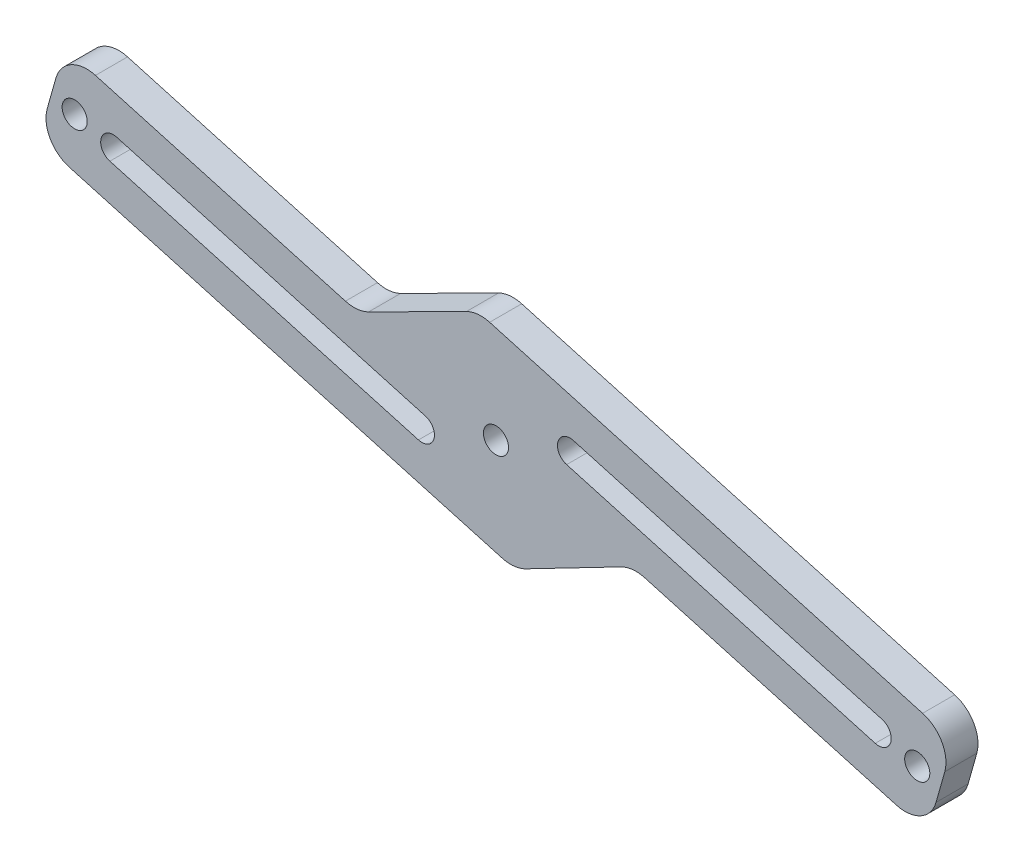
ISO-10303-21;
HEADER;
FILE_DESCRIPTION(('STEP AP214'),'2;1');
FILE_NAME('part.step','',(''),(''),'','','');
FILE_SCHEMA(('AUTOMOTIVE_DESIGN { 1 0 10303 214 1 1 1 1 }'));
ENDSEC;
DATA;
#1=APPLICATION_CONTEXT('core data for automotive mechanical design processes');
#2=APPLICATION_PROTOCOL_DEFINITION('international standard','automotive_design',2000,#1);
#3=PRODUCT_CONTEXT('',#1,'mechanical');
#4=PRODUCT('Part','Part','',(#3));
#5=PRODUCT_RELATED_PRODUCT_CATEGORY('part','',(#4));
#6=PRODUCT_DEFINITION_FORMATION('','',#4);
#7=PRODUCT_DEFINITION_CONTEXT('part definition',#1,'design');
#8=PRODUCT_DEFINITION('design','',#6,#7);
#9=PRODUCT_DEFINITION_SHAPE('','',#8);
#10=(LENGTH_UNIT() NAMED_UNIT(*) SI_UNIT(.MILLI.,.METRE.));
#11=(NAMED_UNIT(*) PLANE_ANGLE_UNIT() SI_UNIT($,.RADIAN.));
#12=(NAMED_UNIT(*) SI_UNIT($,.STERADIAN.) SOLID_ANGLE_UNIT());
#13=UNCERTAINTY_MEASURE_WITH_UNIT(LENGTH_MEASURE(1.E-05),#10,'distance_accuracy_value','');
#14=(GEOMETRIC_REPRESENTATION_CONTEXT(3) GLOBAL_UNCERTAINTY_ASSIGNED_CONTEXT((#13)) GLOBAL_UNIT_ASSIGNED_CONTEXT((#10,
#11,#12)) REPRESENTATION_CONTEXT('',''));
#15=CARTESIAN_POINT('',(0.,0.,0.));
#16=DIRECTION('',(0.,0.,1.));
#17=DIRECTION('',(1.,0.,0.));
#18=AXIS2_PLACEMENT_3D('',#15,#16,#17);
#19=CARTESIAN_POINT('',(500.472634342967,469.074485031773,6.35));
#20=DIRECTION('',(0.,0.,-1.));
#21=DIRECTION('',(-1.,0.,0.));
#22=AXIS2_PLACEMENT_3D('',#19,#20,#21);
#23=CYLINDRICAL_SURFACE('',#22,2.48920000000001);
#24=CARTESIAN_POINT('',(500.472634342967,469.074485031773,0.));
#25=DIRECTION('',(0.,0.,1.));
#26=DIRECTION('',(1.,0.,0.));
#27=AXIS2_PLACEMENT_3D('',#24,#25,#26);
#28=CIRCLE('',#27,2.48920000000001);
#29=CARTESIAN_POINT('',(501.148569899276,471.470153573896,0.));
#30=VERTEX_POINT('',#29);
#31=CARTESIAN_POINT('',(499.796698786657,466.67881648965,0.));
#32=VERTEX_POINT('',#31);
#33=EDGE_CURVE('E278',#30,#32,#28,.T.);
#34=ORIENTED_EDGE('',*,*,#33,.F.);
#35=DIRECTION('',(0.,0.,-1.));
#36=VECTOR('',#35,1.);
#37=CARTESIAN_POINT('',(501.148569899276,471.470153573896,6.35));
#38=LINE('',#37,#36);
#39=CARTESIAN_POINT('',(501.148569899276,471.470153573896,6.35));
#40=VERTEX_POINT('',#39);
#41=EDGE_CURVE('E296',#40,#30,#38,.T.);
#42=ORIENTED_EDGE('',*,*,#41,.F.);
#43=CARTESIAN_POINT('',(500.472634342967,469.074485031773,6.35));
#44=DIRECTION('',(0.,0.,1.));
#45=DIRECTION('',(1.,0.,0.));
#46=AXIS2_PLACEMENT_3D('',#43,#44,#45);
#47=CIRCLE('',#46,2.48920000000001);
#48=CARTESIAN_POINT('',(499.796698786657,466.67881648965,6.35));
#49=VERTEX_POINT('',#48);
#50=EDGE_CURVE('E233',#40,#49,#47,.T.);
#51=ORIENTED_EDGE('',*,*,#50,.T.);
#52=DIRECTION('',(0.,0.,-1.));
#53=VECTOR('',#52,1.);
#54=CARTESIAN_POINT('',(499.796698786657,466.67881648965,6.35));
#55=LINE('',#54,#53);
#56=EDGE_CURVE('E211',#49,#32,#55,.T.);
#57=ORIENTED_EDGE('',*,*,#56,.T.);
#58=EDGE_LOOP('',(#34,#42,#51,#57));
#59=FACE_BOUND('',#58,.T.);
#60=ADVANCED_FACE('F39',(#59),#23,.F.);
#61=CARTESIAN_POINT('',(160.169531661349,567.677058598008,6.35));
#62=DIRECTION('',(-0.271547306889591,-0.962425093251942,0.));
#63=DIRECTION('',(0.962425093251942,-0.271547306889591,0.));
#64=AXIS2_PLACEMENT_3D('',#61,#62,#63);
#65=PLANE('',#64);
#66=DIRECTION('',(-0.962425093251943,0.271547306889591,0.));
#67=VECTOR('',#66,1.);
#68=CARTESIAN_POINT('',(160.169531661349,567.677058598008,0.));
#69=LINE('',#68,#67);
#70=CARTESIAN_POINT('',(562.262563320775,454.226899586407,0.));
#71=VERTEX_POINT('',#70);
#72=EDGE_CURVE('E281',#71,#30,#69,.T.);
#73=ORIENTED_EDGE('',*,*,#72,.F.);
#74=DIRECTION('',(0.,0.,-1.));
#75=VECTOR('',#74,1.);
#76=CARTESIAN_POINT('',(562.262563320775,454.226899586407,6.35));
#77=LINE('',#76,#75);
#78=CARTESIAN_POINT('',(562.262563320775,454.226899586407,6.35));
#79=VERTEX_POINT('',#78);
#80=EDGE_CURVE('E294',#79,#71,#77,.T.);
#81=ORIENTED_EDGE('',*,*,#80,.F.);
#82=DIRECTION('',(-0.962425093251943,0.271547306889591,0.));
#83=VECTOR('',#82,1.);
#84=CARTESIAN_POINT('',(160.169531661349,567.677058598008,6.35));
#85=LINE('',#84,#83);
#86=EDGE_CURVE('E236',#79,#40,#85,.T.);
#87=ORIENTED_EDGE('',*,*,#86,.T.);
#88=ORIENTED_EDGE('',*,*,#41,.T.);
#89=EDGE_LOOP('',(#73,#81,#87,#88));
#90=FACE_BOUND('',#89,.T.);
#91=ADVANCED_FACE('F466',(#90),#65,.T.);
#92=CARTESIAN_POINT('',(561.586627764465,451.831231044284,6.35));
#93=DIRECTION('',(0.,0.,-1.));
#94=DIRECTION('',(-1.,0.,0.));
#95=AXIS2_PLACEMENT_3D('',#92,#93,#94);
#96=CYLINDRICAL_SURFACE('',#95,2.48920000000004);
#97=CARTESIAN_POINT('',(561.586627764465,451.831231044284,0.));
#98=DIRECTION('',(0.,0.,1.));
#99=DIRECTION('',(1.,0.,0.));
#100=AXIS2_PLACEMENT_3D('',#97,#98,#99);
#101=CIRCLE('',#100,2.48920000000004);
#102=CARTESIAN_POINT('',(560.910692208156,449.435562502161,0.));
#103=VERTEX_POINT('',#102);
#104=EDGE_CURVE('E284',#103,#71,#101,.T.);
#105=ORIENTED_EDGE('',*,*,#104,.F.);
#106=DIRECTION('',(0.,0.,-1.));
#107=VECTOR('',#106,1.);
#108=CARTESIAN_POINT('',(560.910692208156,449.435562502161,6.35));
#109=LINE('',#108,#107);
#110=CARTESIAN_POINT('',(560.910692208156,449.435562502161,6.35));
#111=VERTEX_POINT('',#110);
#112=EDGE_CURVE('E292',#111,#103,#109,.T.);
#113=ORIENTED_EDGE('',*,*,#112,.F.);
#114=CARTESIAN_POINT('',(561.586627764465,451.831231044284,6.35));
#115=DIRECTION('',(0.,0.,1.));
#116=DIRECTION('',(1.,0.,0.));
#117=AXIS2_PLACEMENT_3D('',#114,#115,#116);
#118=CIRCLE('',#117,2.48920000000004);
#119=EDGE_CURVE('E239',#111,#79,#118,.T.);
#120=ORIENTED_EDGE('',*,*,#119,.T.);
#121=ORIENTED_EDGE('',*,*,#80,.T.);
#122=EDGE_LOOP('',(#105,#113,#120,#121));
#123=FACE_BOUND('',#122,.T.);
#124=ADVANCED_FACE('F472',(#123),#96,.F.);
#125=CARTESIAN_POINT('',(471.136850143516,458.639858092432,6.35));
#126=DIRECTION('',(0.,0.,-1.));
#127=DIRECTION('',(-1.,0.,0.));
#128=AXIS2_PLACEMENT_3D('',#125,#126,#127);
#129=CYLINDRICAL_SURFACE('',#128,2.48919999999996);
#130=CARTESIAN_POINT('',(471.136850143516,458.639858092432,0.));
#131=DIRECTION('',(0.,0.,1.));
#132=DIRECTION('',(1.,0.,0.));
#133=AXIS2_PLACEMENT_3D('',#130,#131,#132);
#134=CIRCLE('',#133,2.48919999999996);
#135=CARTESIAN_POINT('',(470.460914587206,456.244189550309,0.));
#136=VERTEX_POINT('',#135);
#137=CARTESIAN_POINT('',(471.812785699825,461.035526634555,0.));
#138=VERTEX_POINT('',#137);
#139=EDGE_CURVE('E206',#136,#138,#134,.T.);
#140=ORIENTED_EDGE('',*,*,#139,.F.);
#141=DIRECTION('',(0.,0.,-1.));
#142=VECTOR('',#141,1.);
#143=CARTESIAN_POINT('',(470.460914587206,456.244189550309,6.35));
#144=LINE('',#143,#142);
#145=CARTESIAN_POINT('',(470.460914587206,456.244189550309,6.35));
#146=VERTEX_POINT('',#145);
#147=EDGE_CURVE('E201',#146,#136,#144,.T.);
#148=ORIENTED_EDGE('',*,*,#147,.F.);
#149=CARTESIAN_POINT('',(471.136850143516,458.639858092432,6.35));
#150=DIRECTION('',(0.,0.,1.));
#151=DIRECTION('',(1.,0.,0.));
#152=AXIS2_PLACEMENT_3D('',#149,#150,#151);
#153=CIRCLE('',#152,2.48919999999996);
#154=CARTESIAN_POINT('',(471.812785699825,461.035526634555,6.35));
#155=VERTEX_POINT('',#154);
#156=EDGE_CURVE('E204',#146,#155,#153,.T.);
#157=ORIENTED_EDGE('',*,*,#156,.T.);
#158=DIRECTION('',(0.,0.,-1.));
#159=VECTOR('',#158,1.);
#160=CARTESIAN_POINT('',(471.812785699825,461.035526634555,6.35));
#161=LINE('',#160,#159);
#162=EDGE_CURVE('E244',#155,#138,#161,.T.);
#163=ORIENTED_EDGE('',*,*,#162,.T.);
#164=EDGE_LOOP('',(#140,#148,#157,#163));
#165=FACE_BOUND('',#164,.T.);
#166=ADVANCED_FACE('F203',(#165),#129,.F.);
#167=CARTESIAN_POINT('',(153.92747371788,545.553792979426,6.35));
#168=DIRECTION('',(0.271547306889594,0.962425093251941,0.));
#169=DIRECTION('',(-0.962425093251942,0.271547306889594,0.));
#170=AXIS2_PLACEMENT_3D('',#167,#168,#169);
#171=PLANE('',#170);
#172=DIRECTION('',(0.962425093251942,-0.271547306889594,0.));
#173=VECTOR('',#172,1.);
#174=CARTESIAN_POINT('',(153.92747371788,545.553792979426,0.));
#175=LINE('',#174,#173);
#176=CARTESIAN_POINT('',(409.346921165708,473.487443537798,0.));
#177=VERTEX_POINT('',#176);
#178=EDGE_CURVE('E270',#177,#136,#175,.T.);
#179=ORIENTED_EDGE('',*,*,#178,.F.);
#180=DIRECTION('',(0.,0.,-1.));
#181=VECTOR('',#180,1.);
#182=CARTESIAN_POINT('',(409.346921165708,473.487443537798,6.35));
#183=LINE('',#182,#181);
#184=CARTESIAN_POINT('',(409.346921165708,473.487443537798,6.35));
#185=VERTEX_POINT('',#184);
#186=EDGE_CURVE('E212',#185,#177,#183,.T.);
#187=ORIENTED_EDGE('',*,*,#186,.F.);
#188=DIRECTION('',(0.962425093251942,-0.271547306889594,0.));
#189=VECTOR('',#188,1.);
#190=CARTESIAN_POINT('',(153.92747371788,545.553792979426,6.35));
#191=LINE('',#190,#189);
#192=EDGE_CURVE('E219',#185,#146,#191,.T.);
#193=ORIENTED_EDGE('',*,*,#192,.T.);
#194=ORIENTED_EDGE('',*,*,#147,.T.);
#195=EDGE_LOOP('',(#179,#187,#193,#194));
#196=FACE_BOUND('',#195,.T.);
#197=ADVANCED_FACE('F226',(#196),#171,.T.);
#198=CARTESIAN_POINT('',(410.022856722017,475.883112079921,6.35));
#199=DIRECTION('',(0.,0.,-1.));
#200=DIRECTION('',(-1.,0.,0.));
#201=AXIS2_PLACEMENT_3D('',#198,#199,#200);
#202=CYLINDRICAL_SURFACE('',#201,2.4891999999999);
#203=CARTESIAN_POINT('',(410.022856722017,475.883112079921,0.));
#204=DIRECTION('',(0.,0.,1.));
#205=DIRECTION('',(1.,0.,0.));
#206=AXIS2_PLACEMENT_3D('',#203,#204,#205);
#207=CIRCLE('',#206,2.4891999999999);
#208=CARTESIAN_POINT('',(410.698792278327,478.278780622044,0.));
#209=VERTEX_POINT('',#208);
#210=EDGE_CURVE('E272',#209,#177,#207,.T.);
#211=ORIENTED_EDGE('',*,*,#210,.F.);
#212=DIRECTION('',(0.,0.,-1.));
#213=VECTOR('',#212,1.);
#214=CARTESIAN_POINT('',(410.698792278327,478.278780622044,6.35));
#215=LINE('',#214,#213);
#216=CARTESIAN_POINT('',(410.698792278327,478.278780622044,6.35));
#217=VERTEX_POINT('',#216);
#218=EDGE_CURVE('E300',#217,#209,#215,.T.);
#219=ORIENTED_EDGE('',*,*,#218,.F.);
#220=CARTESIAN_POINT('',(410.022856722017,475.883112079921,6.35));
#221=DIRECTION('',(0.,0.,1.));
#222=DIRECTION('',(1.,0.,0.));
#223=AXIS2_PLACEMENT_3D('',#220,#221,#222);
#224=CIRCLE('',#223,2.4891999999999);
#225=EDGE_CURVE('E227',#217,#185,#224,.T.);
#226=ORIENTED_EDGE('',*,*,#225,.T.);
#227=ORIENTED_EDGE('',*,*,#186,.T.);
#228=EDGE_LOOP('',(#211,#219,#226,#227));
#229=FACE_BOUND('',#228,.T.);
#230=ADVANCED_FACE('F484',(#229),#202,.F.);
#231=CARTESIAN_POINT('',(162.080084203158,574.448489069109,6.35));
#232=DIRECTION('',(0.271547306889585,0.962425093251944,0.));
#233=DIRECTION('',(-0.962425093251944,0.271547306889585,0.));
#234=AXIS2_PLACEMENT_3D('',#231,#232,#233);
#235=PLANE('',#234);
#236=DIRECTION('',(0.962425093251944,-0.271547306889585,0.));
#237=VECTOR('',#236,1.);
#238=CARTESIAN_POINT('',(162.080084203158,574.448489069109,0.));
#239=LINE('',#238,#237);
#240=CARTESIAN_POINT('',(484.55130153564,483.463547768208,0.));
#241=VERTEX_POINT('',#240);
#242=CARTESIAN_POINT('',(570.284515204738,459.27400465876,0.));
#243=VERTEX_POINT('',#242);
#244=EDGE_CURVE('E245',#241,#243,#239,.T.);
#245=ORIENTED_EDGE('',*,*,#244,.F.);
#246=DIRECTION('',(0.,0.,-1.));
#247=VECTOR('',#246,1.);
#248=CARTESIAN_POINT('',(484.55130153564,483.463547768208,6.35));
#249=LINE('',#248,#247);
#250=CARTESIAN_POINT('',(484.55130153564,483.463547768208,6.35));
#251=VERTEX_POINT('',#250);
#252=EDGE_CURVE('E348',#241,#251,#249,.F.);
#253=ORIENTED_EDGE('',*,*,#252,.T.);
#254=DIRECTION('',(0.962425093251944,-0.271547306889585,0.));
#255=VECTOR('',#254,1.);
#256=CARTESIAN_POINT('',(162.080084203158,574.448489069109,6.35));
#257=LINE('',#256,#255);
#258=CARTESIAN_POINT('',(570.284515204738,459.27400465876,6.35));
#259=VERTEX_POINT('',#258);
#260=EDGE_CURVE('E290',#251,#259,#257,.T.);
#261=ORIENTED_EDGE('',*,*,#260,.T.);
#262=DIRECTION('',(0.,0.,-1.));
#263=VECTOR('',#262,1.);
#264=CARTESIAN_POINT('',(570.284515204738,459.27400465876,0.));
#265=LINE('',#264,#263);
#266=EDGE_CURVE('E345',#259,#243,#265,.T.);
#267=ORIENTED_EDGE('',*,*,#266,.T.);
#268=EDGE_LOOP('',(#245,#253,#261,#267));
#269=FACE_BOUND('',#268,.T.);
#270=ADVANCED_FACE('F416',(#269),#235,.T.);
#271=CARTESIAN_POINT('',(-96.9093270912384,192.289097804898,6.35));
#272=DIRECTION('',(0.450052679280969,-0.893002007764832,0.));
#273=DIRECTION('',(0.893002007764832,0.450052679280969,0.));
#274=AXIS2_PLACEMENT_3D('',#271,#272,#273);
#275=PLANE('',#274);
#276=DIRECTION('',(-0.893002007764832,-0.450052679280969,0.));
#277=VECTOR('',#276,1.);
#278=CARTESIAN_POINT('',(-96.9093270912384,192.289097804898,6.35));
#279=LINE('',#278,#277);
#280=CARTESIAN_POINT('',(479.969141623457,483.022711175365,6.35));
#281=VERTEX_POINT('',#280);
#282=CARTESIAN_POINT('',(460.57745657931,473.249743439564,6.35));
#283=VERTEX_POINT('',#282);
#284=EDGE_CURVE('E388',#281,#283,#279,.T.);
#285=ORIENTED_EDGE('',*,*,#284,.F.);
#286=DIRECTION('',(0.,0.,-1.));
#287=VECTOR('',#286,1.);
#288=CARTESIAN_POINT('',(479.969141623457,483.022711175365,0.));
#289=LINE('',#288,#287);
#290=CARTESIAN_POINT('',(479.969141623457,483.022711175365,0.));
#291=VERTEX_POINT('',#290);
#292=EDGE_CURVE('E342',#281,#291,#289,.T.);
#293=ORIENTED_EDGE('',*,*,#292,.T.);
#294=DIRECTION('',(-0.893002007764832,-0.450052679280969,0.));
#295=VECTOR('',#294,1.);
#296=CARTESIAN_POINT('',(-96.9093270912384,192.289097804898,0.));
#297=LINE('',#296,#295);
#298=CARTESIAN_POINT('',(460.57745657931,473.249743439564,0.));
#299=VERTEX_POINT('',#298);
#300=EDGE_CURVE('E248',#291,#299,#297,.T.);
#301=ORIENTED_EDGE('',*,*,#300,.T.);
#302=DIRECTION('',(0.,0.,-1.));
#303=VECTOR('',#302,1.);
#304=CARTESIAN_POINT('',(460.57745657931,473.249743439564,6.35));
#305=LINE('',#304,#303);
#306=EDGE_CURVE('E340',#299,#283,#305,.F.);
#307=ORIENTED_EDGE('',*,*,#306,.T.);
#308=EDGE_LOOP('',(#285,#293,#301,#307));
#309=FACE_BOUND('',#308,.T.);
#310=ADVANCED_FACE('F378',(#309),#275,.F.);
#311=CARTESIAN_POINT('',(157.189897372313,557.116560534774,6.35));
#312=DIRECTION('',(0.271547306889594,0.962425093251942,0.));
#313=DIRECTION('',(-0.962425093251942,0.271547306889594,0.));
#314=AXIS2_PLACEMENT_3D('',#311,#312,#313);
#315=PLANE('',#314);
#316=DIRECTION('',(0.962425093251942,-0.271547306889594,0.));
#317=VECTOR('',#316,1.);
#318=CARTESIAN_POINT('',(157.189897372313,557.116560534774,6.35));
#319=LINE('',#318,#317);
#320=CARTESIAN_POINT('',(406.497945477991,486.774536491895,6.35));
#321=VERTEX_POINT('',#320);
#322=CARTESIAN_POINT('',(455.995296667127,472.808906846721,6.35));
#323=VERTEX_POINT('',#322);
#324=EDGE_CURVE('E386',#321,#323,#319,.T.);
#325=ORIENTED_EDGE('',*,*,#324,.T.);
#326=DIRECTION('',(0.,0.,-1.));
#327=VECTOR('',#326,1.);
#328=CARTESIAN_POINT('',(455.995296667127,472.808906846721,6.35));
#329=LINE('',#328,#327);
#330=CARTESIAN_POINT('',(455.995296667127,472.808906846721,0.));
#331=VERTEX_POINT('',#330);
#332=EDGE_CURVE('E352',#323,#331,#329,.T.);
#333=ORIENTED_EDGE('',*,*,#332,.T.);
#334=DIRECTION('',(0.962425093251942,-0.271547306889594,0.));
#335=VECTOR('',#334,1.);
#336=CARTESIAN_POINT('',(157.189897372313,557.116560534774,0.));
#337=LINE('',#336,#335);
#338=CARTESIAN_POINT('',(406.497945477991,486.774536491895,0.));
#339=VERTEX_POINT('',#338);
#340=EDGE_CURVE('E252',#339,#331,#337,.T.);
#341=ORIENTED_EDGE('',*,*,#340,.F.);
#342=DIRECTION('',(0.,0.,-1.));
#343=VECTOR('',#342,1.);
#344=CARTESIAN_POINT('',(406.497945477991,486.774536491895,6.35));
#345=LINE('',#344,#343);
#346=EDGE_CURVE('E350',#339,#321,#345,.F.);
#347=ORIENTED_EDGE('',*,*,#346,.T.);
#348=EDGE_LOOP('',(#325,#333,#341,#347));
#349=FACE_BOUND('',#348,.T.);
#350=ADVANCED_FACE('F390',(#349),#315,.T.);
#351=CARTESIAN_POINT('',(243.196648763529,-68.6176986441301,6.35));
#352=DIRECTION('',(-0.962425093251942,0.271547306889593,0.));
#353=DIRECTION('',(-0.271547306889593,-0.962425093251942,0.));
#354=AXIS2_PLACEMENT_3D('',#351,#352,#353);
#355=PLANE('',#354);
#356=DIRECTION('',(0.271547306889593,0.962425093251942,0.));
#357=VECTOR('',#356,1.);
#358=CARTESIAN_POINT('',(243.196648763529,-68.6176986441301,6.35));
#359=LINE('',#358,#357);
#360=CARTESIAN_POINT('',(396.937895338343,476.276063206344,6.35));
#361=VERTEX_POINT('',#360);
#362=CARTESIAN_POINT('',(398.662220737092,482.387462548494,6.35));
#363=VERTEX_POINT('',#362);
#364=EDGE_CURVE('E392',#361,#363,#359,.T.);
#365=ORIENTED_EDGE('',*,*,#364,.T.);
#366=DIRECTION('',(0.,0.,-1.));
#367=VECTOR('',#366,1.);
#368=CARTESIAN_POINT('',(398.662220737092,482.387462548494,6.35));
#369=LINE('',#368,#367);
#370=CARTESIAN_POINT('',(398.662220737092,482.387462548494,0.));
#371=VERTEX_POINT('',#370);
#372=EDGE_CURVE('E357',#363,#371,#369,.T.);
#373=ORIENTED_EDGE('',*,*,#372,.T.);
#374=DIRECTION('',(0.271547306889593,0.962425093251942,0.));
#375=VECTOR('',#374,1.);
#376=CARTESIAN_POINT('',(243.196648763529,-68.6176986441301,0.));
#377=LINE('',#376,#375);
#378=CARTESIAN_POINT('',(396.937895338343,476.276063206344,0.));
#379=VERTEX_POINT('',#378);
#380=EDGE_CURVE('E255',#379,#371,#377,.T.);
#381=ORIENTED_EDGE('',*,*,#380,.F.);
#382=DIRECTION('',(0.,0.,-1.));
#383=VECTOR('',#382,1.);
#384=CARTESIAN_POINT('',(396.937895338343,476.276063206344,6.35));
#385=LINE('',#384,#383);
#386=EDGE_CURVE('E355',#379,#361,#385,.F.);
#387=ORIENTED_EDGE('',*,*,#386,.T.);
#388=EDGE_LOOP('',(#365,#373,#381,#387));
#389=FACE_BOUND('',#388,.T.);
#390=ADVANCED_FACE('F504',(#389),#355,.T.);
#391=CARTESIAN_POINT('',(152.016921176066,538.782362508324,6.35));
#392=DIRECTION('',(-0.271547306889593,-0.962425093251942,0.));
#393=DIRECTION('',(0.962425093251942,-0.271547306889593,0.));
#394=AXIS2_PLACEMENT_3D('',#391,#392,#393);
#395=PLANE('',#394);
#396=DIRECTION('',(-0.962425093251942,0.271547306889593,0.));
#397=VECTOR('',#396,1.);
#398=CARTESIAN_POINT('',(152.016921176066,538.782362508324,0.));
#399=LINE('',#398,#397);
#400=CARTESIAN_POINT('',(487.019826565786,444.261617572849,0.));
#401=VERTEX_POINT('',#400);
#402=CARTESIAN_POINT('',(401.324969281744,468.440338465445,0.));
#403=VERTEX_POINT('',#402);
#404=EDGE_CURVE('E258',#401,#403,#399,.T.);
#405=ORIENTED_EDGE('',*,*,#404,.F.);
#406=DIRECTION('',(0.,0.,-1.));
#407=VECTOR('',#406,1.);
#408=CARTESIAN_POINT('',(487.019826565786,444.261617572849,6.35));
#409=LINE('',#408,#407);
#410=CARTESIAN_POINT('',(487.019826565786,444.261617572849,6.35));
#411=VERTEX_POINT('',#410);
#412=EDGE_CURVE('E327',#401,#411,#409,.F.);
#413=ORIENTED_EDGE('',*,*,#412,.T.);
#414=DIRECTION('',(-0.962425093251942,0.271547306889593,0.));
#415=VECTOR('',#414,1.);
#416=CARTESIAN_POINT('',(152.016921176066,538.782362508324,6.35));
#417=LINE('',#416,#415);
#418=CARTESIAN_POINT('',(401.324969281744,468.440338465445,6.35));
#419=VERTEX_POINT('',#418);
#420=EDGE_CURVE('E395',#411,#419,#417,.T.);
#421=ORIENTED_EDGE('',*,*,#420,.T.);
#422=DIRECTION('',(0.,0.,-1.));
#423=VECTOR('',#422,1.);
#424=CARTESIAN_POINT('',(401.324969281744,468.440338465445,6.35));
#425=LINE('',#424,#423);
#426=EDGE_CURVE('E324',#419,#403,#425,.T.);
#427=ORIENTED_EDGE('',*,*,#426,.T.);
#428=EDGE_LOOP('',(#405,#413,#421,#427));
#429=FACE_BOUND('',#428,.T.);
#430=ADVANCED_FACE('F500',(#429),#395,.T.);
#431=CARTESIAN_POINT('',(-77.6544513005473,149.99994252272,6.35));
#432=DIRECTION('',(-0.459741780517421,0.888052642159614,0.));
#433=DIRECTION('',(-0.888052642159614,-0.459741780517421,0.));
#434=AXIS2_PLACEMENT_3D('',#431,#432,#433);
#435=PLANE('',#434);
#436=DIRECTION('',(0.888052642159614,0.459741780517421,0.));
#437=VECTOR('',#436,1.);
#438=CARTESIAN_POINT('',(-77.6544513005473,149.99994252272,0.));
#439=LINE('',#438,#437);
#440=CARTESIAN_POINT('',(491.663512270821,444.733882637285,0.));
#441=VERTEX_POINT('',#440);
#442=CARTESIAN_POINT('',(510.600589118493,454.537541806151,0.));
#443=VERTEX_POINT('',#442);
#444=EDGE_CURVE('E261',#441,#443,#439,.T.);
#445=ORIENTED_EDGE('',*,*,#444,.T.);
#446=DIRECTION('',(0.,0.,-1.));
#447=VECTOR('',#446,1.);
#448=CARTESIAN_POINT('',(510.600589118493,454.537541806151,6.35));
#449=LINE('',#448,#447);
#450=CARTESIAN_POINT('',(510.600589118493,454.537541806151,6.35));
#451=VERTEX_POINT('',#450);
#452=EDGE_CURVE('E310',#443,#451,#449,.F.);
#453=ORIENTED_EDGE('',*,*,#452,.T.);
#454=DIRECTION('',(0.888052642159614,0.459741780517421,0.));
#455=VECTOR('',#454,1.);
#456=CARTESIAN_POINT('',(-77.6544513005473,149.99994252272,6.35));
#457=LINE('',#456,#455);
#458=CARTESIAN_POINT('',(491.663512270821,444.733882637285,6.35));
#459=VERTEX_POINT('',#458);
#460=EDGE_CURVE('E402',#459,#451,#457,.T.);
#461=ORIENTED_EDGE('',*,*,#460,.F.);
#462=DIRECTION('',(0.,0.,-1.));
#463=VECTOR('',#462,1.);
#464=CARTESIAN_POINT('',(491.663512270821,444.733882637285,0.));
#465=LINE('',#464,#463);
#466=EDGE_CURVE('E307',#459,#441,#465,.T.);
#467=ORIENTED_EDGE('',*,*,#466,.T.);
#468=EDGE_LOOP('',(#445,#453,#461,#467));
#469=FACE_BOUND('',#468,.T.);
#470=ADVANCED_FACE('F496',(#469),#435,.F.);
#471=CARTESIAN_POINT('',(156.907108006918,556.114291042661,6.35));
#472=DIRECTION('',(-0.271547306889594,-0.962425093251942,0.));
#473=DIRECTION('',(0.962425093251942,-0.271547306889594,0.));
#474=AXIS2_PLACEMENT_3D('',#471,#472,#473);
#475=PLANE('',#474);
#476=DIRECTION('',(-0.962425093251942,0.271547306889594,0.));
#477=VECTOR('',#476,1.);
#478=CARTESIAN_POINT('',(156.907108006918,556.114291042661,6.35));
#479=LINE('',#478,#477);
#480=CARTESIAN_POINT('',(565.111539008492,440.93980663231,6.35));
#481=VERTEX_POINT('',#480);
#482=CARTESIAN_POINT('',(515.244274823527,455.009806870588,6.35));
#483=VERTEX_POINT('',#482);
#484=EDGE_CURVE('E405',#481,#483,#479,.T.);
#485=ORIENTED_EDGE('',*,*,#484,.T.);
#486=DIRECTION('',(0.,0.,-1.));
#487=VECTOR('',#486,1.);
#488=CARTESIAN_POINT('',(515.244274823527,455.009806870588,6.35));
#489=LINE('',#488,#487);
#490=CARTESIAN_POINT('',(515.244274823527,455.009806870588,0.));
#491=VERTEX_POINT('',#490);
#492=EDGE_CURVE('E304',#483,#491,#489,.T.);
#493=ORIENTED_EDGE('',*,*,#492,.T.);
#494=DIRECTION('',(-0.962425093251942,0.271547306889594,0.));
#495=VECTOR('',#494,1.);
#496=CARTESIAN_POINT('',(156.907108006918,556.114291042661,0.));
#497=LINE('',#496,#495);
#498=CARTESIAN_POINT('',(565.111539008492,440.93980663231,0.));
#499=VERTEX_POINT('',#498);
#500=EDGE_CURVE('E264',#499,#491,#497,.T.);
#501=ORIENTED_EDGE('',*,*,#500,.F.);
#502=DIRECTION('',(0.,0.,-1.));
#503=VECTOR('',#502,1.);
#504=CARTESIAN_POINT('',(565.111539008492,440.93980663231,6.35));
#505=LINE('',#504,#503);
#506=EDGE_CURVE('E298',#499,#481,#505,.F.);
#507=ORIENTED_EDGE('',*,*,#506,.T.);
#508=EDGE_LOOP('',(#485,#493,#501,#507));
#509=FACE_BOUND('',#508,.T.);
#510=ADVANCED_FACE('F482',(#509),#475,.T.);
#511=CARTESIAN_POINT('',(155.279344830498,550.345130063672,6.35));
#512=DIRECTION('',(0.271547306889592,0.962425093251942,0.));
#513=DIRECTION('',(-0.962425093251942,0.271547306889592,0.));
#514=AXIS2_PLACEMENT_3D('',#511,#512,#513);
#515=PLANE('',#514);
#516=DIRECTION('',(0.962425093251942,-0.271547306889592,0.));
#517=VECTOR('',#516,1.);
#518=CARTESIAN_POINT('',(155.279344830498,550.345130063672,0.));
#519=LINE('',#518,#517);
#520=EDGE_CURVE('E275',#209,#138,#519,.T.);
#521=ORIENTED_EDGE('',*,*,#520,.T.);
#522=ORIENTED_EDGE('',*,*,#162,.F.);
#523=DIRECTION('',(0.962425093251942,-0.271547306889592,0.));
#524=VECTOR('',#523,1.);
#525=CARTESIAN_POINT('',(155.279344830498,550.345130063672,6.35));
#526=LINE('',#525,#524);
#527=EDGE_CURVE('E222',#217,#155,#526,.T.);
#528=ORIENTED_EDGE('',*,*,#527,.F.);
#529=ORIENTED_EDGE('',*,*,#218,.T.);
#530=EDGE_LOOP('',(#521,#522,#528,#529));
#531=FACE_BOUND('',#530,.T.);
#532=ADVANCED_FACE('F478',(#531),#515,.F.);
#533=CARTESIAN_POINT('',(414.315830343723,-116.8988098091,6.35));
#534=DIRECTION('',(-0.962425093251941,0.271547306889595,0.));
#535=DIRECTION('',(-0.271547306889595,-0.962425093251942,0.));
#536=AXIS2_PLACEMENT_3D('',#533,#534,#535);
#537=PLANE('',#536);
#538=DIRECTION('',(0.271547306889595,0.962425093251942,0.));
#539=VECTOR('',#538,1.);
#540=CARTESIAN_POINT('',(414.315830343723,-116.8988098091,0.));
#541=LINE('',#540,#539);
#542=CARTESIAN_POINT('',(572.947263749391,445.326880575711,0.));
#543=VERTEX_POINT('',#542);
#544=CARTESIAN_POINT('',(574.67158914814,451.438279917861,0.));
#545=VERTEX_POINT('',#544);
#546=EDGE_CURVE('E267',#543,#545,#541,.T.);
#547=ORIENTED_EDGE('',*,*,#546,.T.);
#548=DIRECTION('',(0.,0.,-1.));
#549=VECTOR('',#548,1.);
#550=CARTESIAN_POINT('',(574.671589148139,451.438279917861,6.35));
#551=LINE('',#550,#549);
#552=CARTESIAN_POINT('',(574.67158914814,451.438279917861,6.35));
#553=VERTEX_POINT('',#552);
#554=EDGE_CURVE('E54',#545,#553,#551,.F.);
#555=ORIENTED_EDGE('',*,*,#554,.T.);
#556=DIRECTION('',(0.271547306889595,0.962425093251942,0.));
#557=VECTOR('',#556,1.);
#558=CARTESIAN_POINT('',(414.315830343723,-116.8988098091,6.35));
#559=LINE('',#558,#557);
#560=CARTESIAN_POINT('',(572.947263749391,445.326880575711,6.35));
#561=VERTEX_POINT('',#560);
#562=EDGE_CURVE('E224',#561,#553,#559,.T.);
#563=ORIENTED_EDGE('',*,*,#562,.F.);
#564=DIRECTION('',(0.,0.,-1.));
#565=VECTOR('',#564,1.);
#566=CARTESIAN_POINT('',(572.947263749391,445.326880575711,0.));
#567=LINE('',#566,#565);
#568=EDGE_CURVE('E360',#561,#543,#567,.T.);
#569=ORIENTED_EDGE('',*,*,#568,.T.);
#570=EDGE_LOOP('',(#547,#555,#563,#569));
#571=FACE_BOUND('',#570,.T.);
#572=ADVANCED_FACE('F481',(#571),#537,.F.);
#573=CARTESIAN_POINT('',(158.817660548731,562.885721513763,6.35));
#574=DIRECTION('',(-0.271547306889592,-0.962425093251942,0.));
#575=DIRECTION('',(0.962425093251942,-0.271547306889592,0.));
#576=AXIS2_PLACEMENT_3D('',#573,#574,#575);
#577=PLANE('',#576);
#578=DIRECTION('',(-0.962425093251942,0.271547306889592,0.));
#579=VECTOR('',#578,1.);
#580=CARTESIAN_POINT('',(158.817660548731,562.885721513763,0.));
#581=LINE('',#580,#579);
#582=EDGE_CURVE('E287',#103,#32,#581,.T.);
#583=ORIENTED_EDGE('',*,*,#582,.T.);
#584=ORIENTED_EDGE('',*,*,#56,.F.);
#585=DIRECTION('',(-0.962425093251942,0.271547306889592,0.));
#586=VECTOR('',#585,1.);
#587=CARTESIAN_POINT('',(158.817660548731,562.885721513763,6.35));
#588=LINE('',#587,#586);
#589=EDGE_CURVE('E242',#111,#49,#588,.T.);
#590=ORIENTED_EDGE('',*,*,#589,.F.);
#591=ORIENTED_EDGE('',*,*,#112,.T.);
#592=EDGE_LOOP('',(#583,#584,#590,#591));
#593=FACE_BOUND('',#592,.T.);
#594=ADVANCED_FACE('F445',(#593),#577,.F.);
#595=CARTESIAN_POINT('',(0.,0.,6.35));
#596=DIRECTION('',(0.,0.,1.));
#597=DIRECTION('',(1.,0.,0.));
#598=AXIS2_PLACEMENT_3D('',#595,#596,#597);
#599=PLANE('',#598);
#600=CARTESIAN_POINT('',(402.38360754433,478.038518828357,6.35));
#601=DIRECTION('',(0.,0.,1.));
#602=DIRECTION('',(1.,0.,0.));
#603=AXIS2_PLACEMENT_3D('',#600,#601,#602);
#604=CIRCLE('',#603,2.48920000000001);
#605=CARTESIAN_POINT('',(404.87280754433,478.038518828357,6.35));
#606=VERTEX_POINT('',#605);
#607=EDGE_CURVE('E432',#606,#606,#604,.T.);
#608=ORIENTED_EDGE('',*,*,#607,.F.);
#609=EDGE_LOOP('',(#608));
#610=FACE_BOUND('',#609,.T.);
#611=CARTESIAN_POINT('',(569.225876942153,449.675824295848,6.35));
#612=DIRECTION('',(0.,0.,1.));
#613=DIRECTION('',(1.,0.,0.));
#614=AXIS2_PLACEMENT_3D('',#611,#612,#613);
#615=CIRCLE('',#614,2.48919999999995);
#616=CARTESIAN_POINT('',(571.715076942153,449.675824295848,6.35));
#617=VERTEX_POINT('',#616);
#618=EDGE_CURVE('E426',#617,#617,#615,.T.);
#619=ORIENTED_EDGE('',*,*,#618,.F.);
#620=EDGE_LOOP('',(#619));
#621=FACE_BOUND('',#620,.T.);
#622=CARTESIAN_POINT('',(485.804742243241,463.857171562102,6.35));
#623=DIRECTION('',(0.,0.,1.));
#624=DIRECTION('',(1.,0.,0.));
#625=AXIS2_PLACEMENT_3D('',#622,#623,#624);
#626=CIRCLE('',#625,2.48920000000001);
#627=CARTESIAN_POINT('',(488.293942243242,463.857171562102,6.35));
#628=VERTEX_POINT('',#627);
#629=EDGE_CURVE('E423',#628,#628,#626,.T.);
#630=ORIENTED_EDGE('',*,*,#629,.F.);
#631=EDGE_LOOP('',(#630));
#632=FACE_BOUND('',#631,.T.);
#633=ORIENTED_EDGE('',*,*,#420,.F.);
#634=CARTESIAN_POINT('',(488.744151964535,450.373016914999,6.35));
#635=DIRECTION('',(0.,0.,1.));
#636=DIRECTION('',(1.,0.,0.));
#637=AXIS2_PLACEMENT_3D('',#634,#635,#636);
#638=CIRCLE('',#637,6.35);
#639=EDGE_CURVE('E338',#411,#459,#638,.T.);
#640=ORIENTED_EDGE('',*,*,#639,.T.);
#641=ORIENTED_EDGE('',*,*,#460,.T.);
#642=CARTESIAN_POINT('',(513.519949424778,448.898407528438,6.35));
#643=DIRECTION('',(0.,0.,1.));
#644=DIRECTION('',(1.,0.,0.));
#645=AXIS2_PLACEMENT_3D('',#642,#643,#644);
#646=CIRCLE('',#645,6.35);
#647=EDGE_CURVE('E366',#451,#483,#646,.F.);
#648=ORIENTED_EDGE('',*,*,#647,.T.);
#649=ORIENTED_EDGE('',*,*,#484,.F.);
#650=CARTESIAN_POINT('',(566.835864407241,447.05120597446,6.35));
#651=DIRECTION('',(0.,0.,1.));
#652=DIRECTION('',(1.,0.,0.));
#653=AXIS2_PLACEMENT_3D('',#650,#651,#652);
#654=CIRCLE('',#653,6.35);
#655=EDGE_CURVE('E61',#481,#561,#654,.T.);
#656=ORIENTED_EDGE('',*,*,#655,.T.);
#657=ORIENTED_EDGE('',*,*,#562,.T.);
#658=CARTESIAN_POINT('',(568.56018980599,453.16260531661,6.35));
#659=DIRECTION('',(0.,0.,1.));
#660=DIRECTION('',(1.,0.,0.));
#661=AXIS2_PLACEMENT_3D('',#658,#659,#660);
#662=CIRCLE('',#661,6.35);
#663=EDGE_CURVE('E332',#553,#259,#662,.T.);
#664=ORIENTED_EDGE('',*,*,#663,.T.);
#665=ORIENTED_EDGE('',*,*,#260,.F.);
#666=CARTESIAN_POINT('',(482.826976136891,477.352148426058,6.35));
#667=DIRECTION('',(0.,0.,1.));
#668=DIRECTION('',(1.,0.,0.));
#669=AXIS2_PLACEMENT_3D('',#666,#667,#668);
#670=CIRCLE('',#669,6.35);
#671=EDGE_CURVE('E336',#251,#281,#670,.T.);
#672=ORIENTED_EDGE('',*,*,#671,.T.);
#673=ORIENTED_EDGE('',*,*,#284,.T.);
#674=CARTESIAN_POINT('',(457.719622065876,478.920306188871,6.35));
#675=DIRECTION('',(0.,0.,1.));
#676=DIRECTION('',(1.,0.,0.));
#677=AXIS2_PLACEMENT_3D('',#674,#675,#676);
#678=CIRCLE('',#677,6.35);
#679=EDGE_CURVE('E11',#283,#323,#678,.F.);
#680=ORIENTED_EDGE('',*,*,#679,.T.);
#681=ORIENTED_EDGE('',*,*,#324,.F.);
#682=CARTESIAN_POINT('',(404.773620079242,480.663137149745,6.35));
#683=DIRECTION('',(0.,0.,1.));
#684=DIRECTION('',(1.,0.,0.));
#685=AXIS2_PLACEMENT_3D('',#682,#683,#684);
#686=CIRCLE('',#685,6.35);
#687=EDGE_CURVE('E334',#321,#363,#686,.T.);
#688=ORIENTED_EDGE('',*,*,#687,.T.);
#689=ORIENTED_EDGE('',*,*,#364,.F.);
#690=CARTESIAN_POINT('',(403.049294680493,474.551737807595,6.35));
#691=DIRECTION('',(0.,0.,1.));
#692=DIRECTION('',(1.,0.,0.));
#693=AXIS2_PLACEMENT_3D('',#690,#691,#692);
#694=CIRCLE('',#693,6.35);
#695=EDGE_CURVE('E329',#361,#419,#694,.T.);
#696=ORIENTED_EDGE('',*,*,#695,.T.);
#697=EDGE_LOOP('',(#633,#640,#641,#648,#649,#656,#657,#664,#665,#672,#673,#680,#681,#688,#689,#696));
#698=FACE_BOUND('',#697,.T.);
#699=ORIENTED_EDGE('',*,*,#156,.F.);
#700=ORIENTED_EDGE('',*,*,#192,.F.);
#701=ORIENTED_EDGE('',*,*,#225,.F.);
#702=ORIENTED_EDGE('',*,*,#527,.T.);
#703=EDGE_LOOP('',(#699,#700,#701,#702));
#704=FACE_BOUND('',#703,.T.);
#705=ORIENTED_EDGE('',*,*,#50,.F.);
#706=ORIENTED_EDGE('',*,*,#86,.F.);
#707=ORIENTED_EDGE('',*,*,#119,.F.);
#708=ORIENTED_EDGE('',*,*,#589,.T.);
#709=EDGE_LOOP('',(#705,#706,#707,#708));
#710=FACE_BOUND('',#709,.T.);
#711=ADVANCED_FACE('F216',(#610,#621,#632,#698,#704,#710),#599,.T.);
#712=CARTESIAN_POINT('',(0.,0.,0.));
#713=DIRECTION('',(0.,0.,1.));
#714=DIRECTION('',(1.,0.,0.));
#715=AXIS2_PLACEMENT_3D('',#712,#713,#714);
#716=PLANE('',#715);
#717=CARTESIAN_POINT('',(402.38360754433,478.038518828357,0.));
#718=DIRECTION('',(0.,0.,1.));
#719=DIRECTION('',(1.,0.,0.));
#720=AXIS2_PLACEMENT_3D('',#717,#718,#719);
#721=CIRCLE('',#720,2.48920000000001);
#722=CARTESIAN_POINT('',(404.87280754433,478.038518828357,0.));
#723=VERTEX_POINT('',#722);
#724=EDGE_CURVE('E429',#723,#723,#721,.T.);
#725=ORIENTED_EDGE('',*,*,#724,.T.);
#726=EDGE_LOOP('',(#725));
#727=FACE_BOUND('',#726,.T.);
#728=CARTESIAN_POINT('',(569.225876942153,449.675824295848,0.));
#729=DIRECTION('',(0.,0.,1.));
#730=DIRECTION('',(1.,0.,0.));
#731=AXIS2_PLACEMENT_3D('',#728,#729,#730);
#732=CIRCLE('',#731,2.48919999999995);
#733=CARTESIAN_POINT('',(571.715076942153,449.675824295848,0.));
#734=VERTEX_POINT('',#733);
#735=EDGE_CURVE('E435',#734,#734,#732,.T.);
#736=ORIENTED_EDGE('',*,*,#735,.T.);
#737=EDGE_LOOP('',(#736));
#738=FACE_BOUND('',#737,.T.);
#739=CARTESIAN_POINT('',(485.804742243241,463.857171562102,0.));
#740=DIRECTION('',(0.,0.,1.));
#741=DIRECTION('',(1.,0.,0.));
#742=AXIS2_PLACEMENT_3D('',#739,#740,#741);
#743=CIRCLE('',#742,2.48920000000001);
#744=CARTESIAN_POINT('',(488.293942243242,463.857171562102,0.));
#745=VERTEX_POINT('',#744);
#746=EDGE_CURVE('E249',#745,#745,#743,.T.);
#747=ORIENTED_EDGE('',*,*,#746,.T.);
#748=EDGE_LOOP('',(#747));
#749=FACE_BOUND('',#748,.T.);
#750=ORIENTED_EDGE('',*,*,#444,.F.);
#751=CARTESIAN_POINT('',(488.744151964535,450.373016914999,0.));
#752=DIRECTION('',(0.,0.,1.));
#753=DIRECTION('',(1.,0.,0.));
#754=AXIS2_PLACEMENT_3D('',#751,#752,#753);
#755=CIRCLE('',#754,6.35);
#756=EDGE_CURVE('E322',#441,#401,#755,.F.);
#757=ORIENTED_EDGE('',*,*,#756,.T.);
#758=ORIENTED_EDGE('',*,*,#404,.T.);
#759=CARTESIAN_POINT('',(403.049294680493,474.551737807595,0.));
#760=DIRECTION('',(0.,0.,1.));
#761=DIRECTION('',(1.,0.,0.));
#762=AXIS2_PLACEMENT_3D('',#759,#760,#761);
#763=CIRCLE('',#762,6.35);
#764=EDGE_CURVE('E312',#403,#379,#763,.F.);
#765=ORIENTED_EDGE('',*,*,#764,.T.);
#766=ORIENTED_EDGE('',*,*,#380,.T.);
#767=CARTESIAN_POINT('',(404.773620079242,480.663137149745,0.));
#768=DIRECTION('',(0.,0.,1.));
#769=DIRECTION('',(1.,0.,0.));
#770=AXIS2_PLACEMENT_3D('',#767,#768,#769);
#771=CIRCLE('',#770,6.35);
#772=EDGE_CURVE('E318',#371,#339,#771,.F.);
#773=ORIENTED_EDGE('',*,*,#772,.T.);
#774=ORIENTED_EDGE('',*,*,#340,.T.);
#775=CARTESIAN_POINT('',(457.719622065876,478.920306188871,0.));
#776=DIRECTION('',(0.,0.,1.));
#777=DIRECTION('',(1.,0.,0.));
#778=AXIS2_PLACEMENT_3D('',#775,#776,#777);
#779=CIRCLE('',#778,6.35);
#780=EDGE_CURVE('E47',#331,#299,#779,.T.);
#781=ORIENTED_EDGE('',*,*,#780,.T.);
#782=ORIENTED_EDGE('',*,*,#300,.F.);
#783=CARTESIAN_POINT('',(482.826976136891,477.352148426058,0.));
#784=DIRECTION('',(0.,0.,1.));
#785=DIRECTION('',(1.,0.,0.));
#786=AXIS2_PLACEMENT_3D('',#783,#784,#785);
#787=CIRCLE('',#786,6.35);
#788=EDGE_CURVE('E320',#291,#241,#787,.F.);
#789=ORIENTED_EDGE('',*,*,#788,.T.);
#790=ORIENTED_EDGE('',*,*,#244,.T.);
#791=CARTESIAN_POINT('',(568.56018980599,453.16260531661,0.));
#792=DIRECTION('',(0.,0.,1.));
#793=DIRECTION('',(1.,0.,0.));
#794=AXIS2_PLACEMENT_3D('',#791,#792,#793);
#795=CIRCLE('',#794,6.35);
#796=EDGE_CURVE('E316',#243,#545,#795,.F.);
#797=ORIENTED_EDGE('',*,*,#796,.T.);
#798=ORIENTED_EDGE('',*,*,#546,.F.);
#799=CARTESIAN_POINT('',(566.835864407241,447.05120597446,0.));
#800=DIRECTION('',(0.,0.,1.));
#801=DIRECTION('',(1.,0.,0.));
#802=AXIS2_PLACEMENT_3D('',#799,#800,#801);
#803=CIRCLE('',#802,6.35);
#804=EDGE_CURVE('E314',#543,#499,#803,.F.);
#805=ORIENTED_EDGE('',*,*,#804,.T.);
#806=ORIENTED_EDGE('',*,*,#500,.T.);
#807=CARTESIAN_POINT('',(513.519949424778,448.898407528438,0.));
#808=DIRECTION('',(0.,0.,1.));
#809=DIRECTION('',(1.,0.,0.));
#810=AXIS2_PLACEMENT_3D('',#807,#808,#809);
#811=CIRCLE('',#810,6.35);
#812=EDGE_CURVE('E364',#491,#443,#811,.T.);
#813=ORIENTED_EDGE('',*,*,#812,.T.);
#814=EDGE_LOOP('',(#750,#757,#758,#765,#766,#773,#774,#781,#782,#789,#790,#797,#798,#805,#806,#813));
#815=FACE_BOUND('',#814,.T.);
#816=ORIENTED_EDGE('',*,*,#139,.T.);
#817=ORIENTED_EDGE('',*,*,#520,.F.);
#818=ORIENTED_EDGE('',*,*,#210,.T.);
#819=ORIENTED_EDGE('',*,*,#178,.T.);
#820=EDGE_LOOP('',(#816,#817,#818,#819));
#821=FACE_BOUND('',#820,.T.);
#822=ORIENTED_EDGE('',*,*,#33,.T.);
#823=ORIENTED_EDGE('',*,*,#582,.F.);
#824=ORIENTED_EDGE('',*,*,#104,.T.);
#825=ORIENTED_EDGE('',*,*,#72,.T.);
#826=EDGE_LOOP('',(#822,#823,#824,#825));
#827=FACE_BOUND('',#826,.T.);
#828=ADVANCED_FACE('F370',(#727,#738,#749,#815,#821,#827),#716,.F.);
#829=CARTESIAN_POINT('',(513.519949424778,448.898407528438,6.35));
#830=DIRECTION('',(0.,0.,-1.));
#831=DIRECTION('',(-1.,0.,0.));
#832=AXIS2_PLACEMENT_3D('',#829,#830,#831);
#833=CYLINDRICAL_SURFACE('',#832,6.35);
#834=ORIENTED_EDGE('',*,*,#647,.F.);
#835=ORIENTED_EDGE('',*,*,#452,.F.);
#836=ORIENTED_EDGE('',*,*,#812,.F.);
#837=ORIENTED_EDGE('',*,*,#492,.F.);
#838=EDGE_LOOP('',(#834,#835,#836,#837));
#839=FACE_BOUND('',#838,.T.);
#840=ADVANCED_FACE('F515',(#839),#833,.F.);
#841=CARTESIAN_POINT('',(488.744151964535,450.373016914999,6.35));
#842=DIRECTION('',(0.,0.,1.));
#843=DIRECTION('',(1.,0.,0.));
#844=AXIS2_PLACEMENT_3D('',#841,#842,#843);
#845=CYLINDRICAL_SURFACE('',#844,6.35);
#846=ORIENTED_EDGE('',*,*,#639,.F.);
#847=ORIENTED_EDGE('',*,*,#412,.F.);
#848=ORIENTED_EDGE('',*,*,#756,.F.);
#849=ORIENTED_EDGE('',*,*,#466,.F.);
#850=EDGE_LOOP('',(#846,#847,#848,#849));
#851=FACE_BOUND('',#850,.T.);
#852=ADVANCED_FACE('F518',(#851),#845,.T.);
#853=CARTESIAN_POINT('',(482.826976136891,477.352148426058,6.35));
#854=DIRECTION('',(0.,0.,1.));
#855=DIRECTION('',(1.,0.,0.));
#856=AXIS2_PLACEMENT_3D('',#853,#854,#855);
#857=CYLINDRICAL_SURFACE('',#856,6.35);
#858=ORIENTED_EDGE('',*,*,#671,.F.);
#859=ORIENTED_EDGE('',*,*,#252,.F.);
#860=ORIENTED_EDGE('',*,*,#788,.F.);
#861=ORIENTED_EDGE('',*,*,#292,.F.);
#862=EDGE_LOOP('',(#858,#859,#860,#861));
#863=FACE_BOUND('',#862,.T.);
#864=ADVANCED_FACE('F421',(#863),#857,.T.);
#865=CARTESIAN_POINT('',(457.719622065876,478.920306188871,6.35));
#866=DIRECTION('',(0.,0.,-1.));
#867=DIRECTION('',(-1.,0.,0.));
#868=AXIS2_PLACEMENT_3D('',#865,#866,#867);
#869=CYLINDRICAL_SURFACE('',#868,6.35);
#870=ORIENTED_EDGE('',*,*,#679,.F.);
#871=ORIENTED_EDGE('',*,*,#306,.F.);
#872=ORIENTED_EDGE('',*,*,#780,.F.);
#873=ORIENTED_EDGE('',*,*,#332,.F.);
#874=EDGE_LOOP('',(#870,#871,#872,#873));
#875=FACE_BOUND('',#874,.T.);
#876=ADVANCED_FACE('F382',(#875),#869,.F.);
#877=CARTESIAN_POINT('',(404.773620079242,480.663137149745,6.35));
#878=DIRECTION('',(0.,0.,-1.));
#879=DIRECTION('',(-1.,0.,0.));
#880=AXIS2_PLACEMENT_3D('',#877,#878,#879);
#881=CYLINDRICAL_SURFACE('',#880,6.35);
#882=ORIENTED_EDGE('',*,*,#687,.F.);
#883=ORIENTED_EDGE('',*,*,#346,.F.);
#884=ORIENTED_EDGE('',*,*,#772,.F.);
#885=ORIENTED_EDGE('',*,*,#372,.F.);
#886=EDGE_LOOP('',(#882,#883,#884,#885));
#887=FACE_BOUND('',#886,.T.);
#888=ADVANCED_FACE('F527',(#887),#881,.T.);
#889=CARTESIAN_POINT('',(568.56018980599,453.16260531661,6.35));
#890=DIRECTION('',(0.,0.,1.));
#891=DIRECTION('',(1.,0.,0.));
#892=AXIS2_PLACEMENT_3D('',#889,#890,#891);
#893=CYLINDRICAL_SURFACE('',#892,6.35);
#894=ORIENTED_EDGE('',*,*,#663,.F.);
#895=ORIENTED_EDGE('',*,*,#554,.F.);
#896=ORIENTED_EDGE('',*,*,#796,.F.);
#897=ORIENTED_EDGE('',*,*,#266,.F.);
#898=EDGE_LOOP('',(#894,#895,#896,#897));
#899=FACE_BOUND('',#898,.T.);
#900=ADVANCED_FACE('F413',(#899),#893,.T.);
#901=CARTESIAN_POINT('',(566.835864407241,447.05120597446,6.35));
#902=DIRECTION('',(0.,0.,1.));
#903=DIRECTION('',(1.,0.,0.));
#904=AXIS2_PLACEMENT_3D('',#901,#902,#903);
#905=CYLINDRICAL_SURFACE('',#904,6.35);
#906=ORIENTED_EDGE('',*,*,#655,.F.);
#907=ORIENTED_EDGE('',*,*,#506,.F.);
#908=ORIENTED_EDGE('',*,*,#804,.F.);
#909=ORIENTED_EDGE('',*,*,#568,.F.);
#910=EDGE_LOOP('',(#906,#907,#908,#909));
#911=FACE_BOUND('',#910,.T.);
#912=ADVANCED_FACE('F461',(#911),#905,.T.);
#913=CARTESIAN_POINT('',(403.049294680493,474.551737807595,6.35));
#914=DIRECTION('',(0.,0.,-1.));
#915=DIRECTION('',(-1.,0.,0.));
#916=AXIS2_PLACEMENT_3D('',#913,#914,#915);
#917=CYLINDRICAL_SURFACE('',#916,6.35);
#918=ORIENTED_EDGE('',*,*,#695,.F.);
#919=ORIENTED_EDGE('',*,*,#386,.F.);
#920=ORIENTED_EDGE('',*,*,#764,.F.);
#921=ORIENTED_EDGE('',*,*,#426,.F.);
#922=EDGE_LOOP('',(#918,#919,#920,#921));
#923=FACE_BOUND('',#922,.T.);
#924=ADVANCED_FACE('F41',(#923),#917,.T.);
#925=CARTESIAN_POINT('',(485.804742243241,463.857171562102,0.));
#926=DIRECTION('',(0.,0.,1.));
#927=DIRECTION('',(1.,0.,0.));
#928=AXIS2_PLACEMENT_3D('',#925,#926,#927);
#929=CYLINDRICAL_SURFACE('',#928,2.48920000000001);
#930=ORIENTED_EDGE('',*,*,#746,.F.);
#931=EDGE_LOOP('',(#930));
#932=FACE_BOUND('',#931,.T.);
#933=ORIENTED_EDGE('',*,*,#629,.T.);
#934=EDGE_LOOP('',(#933));
#935=FACE_BOUND('',#934,.T.);
#936=ADVANCED_FACE('F450',(#932,#935),#929,.F.);
#937=CARTESIAN_POINT('',(569.225876942153,449.675824295848,0.));
#938=DIRECTION('',(0.,0.,1.));
#939=DIRECTION('',(1.,0.,0.));
#940=AXIS2_PLACEMENT_3D('',#937,#938,#939);
#941=CYLINDRICAL_SURFACE('',#940,2.48919999999995);
#942=ORIENTED_EDGE('',*,*,#735,.F.);
#943=EDGE_LOOP('',(#942));
#944=FACE_BOUND('',#943,.T.);
#945=ORIENTED_EDGE('',*,*,#618,.T.);
#946=EDGE_LOOP('',(#945));
#947=FACE_BOUND('',#946,.T.);
#948=ADVANCED_FACE('F441',(#944,#947),#941,.F.);
#949=CARTESIAN_POINT('',(402.38360754433,478.038518828357,0.));
#950=DIRECTION('',(0.,0.,1.));
#951=DIRECTION('',(1.,0.,0.));
#952=AXIS2_PLACEMENT_3D('',#949,#950,#951);
#953=CYLINDRICAL_SURFACE('',#952,2.48920000000001);
#954=ORIENTED_EDGE('',*,*,#724,.F.);
#955=EDGE_LOOP('',(#954));
#956=FACE_BOUND('',#955,.T.);
#957=ORIENTED_EDGE('',*,*,#607,.T.);
#958=EDGE_LOOP('',(#957));
#959=FACE_BOUND('',#958,.T.);
#960=ADVANCED_FACE('F458',(#956,#959),#953,.F.);
#961=CLOSED_SHELL('',(#60,#91,#124,#166,#197,#230,#270,#310,#350,#390,#430,#470,#510,#532,#572,
#594,#711,#828,#840,#852,#864,#876,#888,#900,#912,#924,#936,#948,#960));
#962=MANIFOLD_SOLID_BREP('B2',#961);
#963=ADVANCED_BREP_SHAPE_REPRESENTATION('',(#18,#962),#14);
#964=SHAPE_DEFINITION_REPRESENTATION(#9,#963);
ENDSEC;
END-ISO-10303-21;
